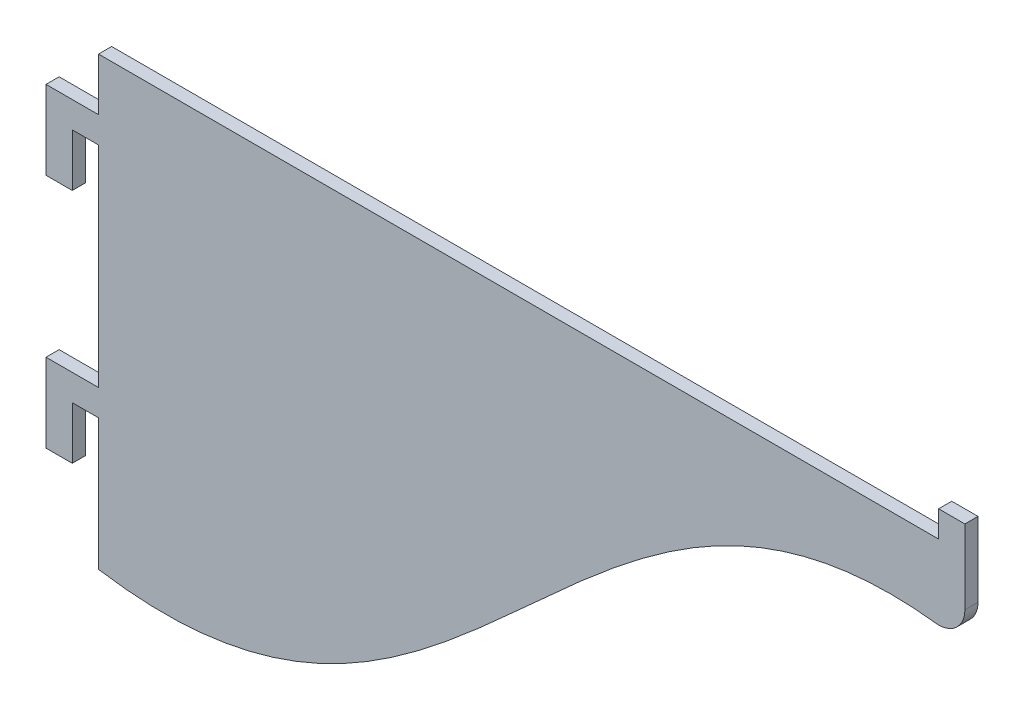
ISO-10303-21;
HEADER;
FILE_DESCRIPTION(('STEP AP214'),'2;1');
FILE_NAME('part.step','',(''),(''),'','','');
FILE_SCHEMA(('AUTOMOTIVE_DESIGN { 1 0 10303 214 1 1 1 1 }'));
ENDSEC;
DATA;
#1=APPLICATION_CONTEXT('core data for automotive mechanical design processes');
#2=APPLICATION_PROTOCOL_DEFINITION('international standard','automotive_design',2000,#1);
#3=PRODUCT_CONTEXT('',#1,'mechanical');
#4=PRODUCT('Part','Part','',(#3));
#5=PRODUCT_RELATED_PRODUCT_CATEGORY('part','',(#4));
#6=PRODUCT_DEFINITION_FORMATION('','',#4);
#7=PRODUCT_DEFINITION_CONTEXT('part definition',#1,'design');
#8=PRODUCT_DEFINITION('design','',#6,#7);
#9=PRODUCT_DEFINITION_SHAPE('','',#8);
#10=(LENGTH_UNIT() NAMED_UNIT(*) SI_UNIT(.MILLI.,.METRE.));
#11=(NAMED_UNIT(*) PLANE_ANGLE_UNIT() SI_UNIT($,.RADIAN.));
#12=(NAMED_UNIT(*) SI_UNIT($,.STERADIAN.) SOLID_ANGLE_UNIT());
#13=UNCERTAINTY_MEASURE_WITH_UNIT(LENGTH_MEASURE(1.E-05),#10,'distance_accuracy_value','');
#14=(GEOMETRIC_REPRESENTATION_CONTEXT(3) GLOBAL_UNCERTAINTY_ASSIGNED_CONTEXT((#13)) GLOBAL_UNIT_ASSIGNED_CONTEXT((#10,
#11,#12)) REPRESENTATION_CONTEXT('',''));
#15=CARTESIAN_POINT('',(0.,0.,0.));
#16=DIRECTION('',(0.,0.,1.));
#17=DIRECTION('',(1.,0.,0.));
#18=AXIS2_PLACEMENT_3D('',#15,#16,#17);
#19=CARTESIAN_POINT('',(0.,0.,3.175));
#20=DIRECTION('',(0.,-1.,0.));
#21=DIRECTION('',(0.,0.,-1.));
#22=AXIS2_PLACEMENT_3D('',#19,#20,#21);
#23=PLANE('',#22);
#24=DIRECTION('',(-1.,0.,0.));
#25=VECTOR('',#24,1.);
#26=CARTESIAN_POINT('',(0.,0.,0.));
#27=LINE('',#26,#25);
#28=CARTESIAN_POINT('',(203.2,0.,0.));
#29=VERTEX_POINT('',#28);
#30=CARTESIAN_POINT('',(0.,0.,0.));
#31=VERTEX_POINT('',#30);
#32=EDGE_CURVE('E210',#29,#31,#27,.T.);
#33=ORIENTED_EDGE('',*,*,#32,.T.);
#34=DIRECTION('',(0.,0.,-1.));
#35=VECTOR('',#34,1.);
#36=CARTESIAN_POINT('',(0.,0.,3.175));
#37=LINE('',#36,#35);
#38=CARTESIAN_POINT('',(0.,0.,3.175));
#39=VERTEX_POINT('',#38);
#40=EDGE_CURVE('E11',#39,#31,#37,.T.);
#41=ORIENTED_EDGE('',*,*,#40,.F.);
#42=DIRECTION('',(-1.,0.,0.));
#43=VECTOR('',#42,1.);
#44=CARTESIAN_POINT('',(0.,0.,3.175));
#45=LINE('',#44,#43);
#46=CARTESIAN_POINT('',(203.2,0.,3.175));
#47=VERTEX_POINT('',#46);
#48=EDGE_CURVE('E270',#47,#39,#45,.T.);
#49=ORIENTED_EDGE('',*,*,#48,.F.);
#50=DIRECTION('',(0.,0.,-1.));
#51=VECTOR('',#50,1.);
#52=CARTESIAN_POINT('',(203.2,0.,3.175));
#53=LINE('',#52,#51);
#54=EDGE_CURVE('E206',#47,#29,#53,.T.);
#55=ORIENTED_EDGE('',*,*,#54,.T.);
#56=EDGE_LOOP('',(#33,#41,#49,#55));
#57=FACE_BOUND('',#56,.T.);
#58=ADVANCED_FACE('F43',(#57),#23,.F.);
#59=CARTESIAN_POINT('',(0.,0.,3.175));
#60=DIRECTION('',(1.,0.,0.));
#61=DIRECTION('',(0.,1.,0.));
#62=AXIS2_PLACEMENT_3D('',#59,#60,#61);
#63=PLANE('',#62);
#64=DIRECTION('',(0.,-1.,0.));
#65=VECTOR('',#64,1.);
#66=CARTESIAN_POINT('',(0.,0.,0.));
#67=LINE('',#66,#65);
#68=CARTESIAN_POINT('',(0.,-12.7,0.));
#69=VERTEX_POINT('',#68);
#70=EDGE_CURVE('E214',#31,#69,#67,.T.);
#71=ORIENTED_EDGE('',*,*,#70,.T.);
#72=DIRECTION('',(0.,0.,-1.));
#73=VECTOR('',#72,1.);
#74=CARTESIAN_POINT('',(0.,-12.7,3.175));
#75=LINE('',#74,#73);
#76=CARTESIAN_POINT('',(0.,-12.7,3.175));
#77=VERTEX_POINT('',#76);
#78=EDGE_CURVE('E52',#77,#69,#75,.T.);
#79=ORIENTED_EDGE('',*,*,#78,.F.);
#80=DIRECTION('',(0.,-1.,0.));
#81=VECTOR('',#80,1.);
#82=CARTESIAN_POINT('',(0.,0.,3.175));
#83=LINE('',#82,#81);
#84=EDGE_CURVE('E136',#39,#77,#83,.T.);
#85=ORIENTED_EDGE('',*,*,#84,.F.);
#86=ORIENTED_EDGE('',*,*,#40,.T.);
#87=EDGE_LOOP('',(#71,#79,#85,#86));
#88=FACE_BOUND('',#87,.T.);
#89=ADVANCED_FACE('F443',(#88),#63,.F.);
#90=CARTESIAN_POINT('',(0.,-12.7,3.175));
#91=DIRECTION('',(0.,-1.,0.));
#92=DIRECTION('',(1.,0.,0.));
#93=AXIS2_PLACEMENT_3D('',#90,#91,#92);
#94=PLANE('',#93);
#95=DIRECTION('',(-1.,0.,0.));
#96=VECTOR('',#95,1.);
#97=CARTESIAN_POINT('',(0.,-12.7,0.));
#98=LINE('',#97,#96);
#99=CARTESIAN_POINT('',(-12.7,-12.7,0.));
#100=VERTEX_POINT('',#99);
#101=EDGE_CURVE('E217',#69,#100,#98,.T.);
#102=ORIENTED_EDGE('',*,*,#101,.T.);
#103=DIRECTION('',(0.,0.,-1.));
#104=VECTOR('',#103,1.);
#105=CARTESIAN_POINT('',(-12.7,-12.7,3.175));
#106=LINE('',#105,#104);
#107=CARTESIAN_POINT('',(-12.7,-12.7,3.175));
#108=VERTEX_POINT('',#107);
#109=EDGE_CURVE('E325',#108,#100,#106,.T.);
#110=ORIENTED_EDGE('',*,*,#109,.F.);
#111=DIRECTION('',(-1.,0.,0.));
#112=VECTOR('',#111,1.);
#113=CARTESIAN_POINT('',(0.,-12.7,3.175));
#114=LINE('',#113,#112);
#115=EDGE_CURVE('E335',#77,#108,#114,.T.);
#116=ORIENTED_EDGE('',*,*,#115,.F.);
#117=ORIENTED_EDGE('',*,*,#78,.T.);
#118=EDGE_LOOP('',(#102,#110,#116,#117));
#119=FACE_BOUND('',#118,.T.);
#120=ADVANCED_FACE('F333',(#119),#94,.F.);
#121=CARTESIAN_POINT('',(-12.7,-12.7,3.175));
#122=DIRECTION('',(1.,0.,0.));
#123=DIRECTION('',(0.,1.,0.));
#124=AXIS2_PLACEMENT_3D('',#121,#122,#123);
#125=PLANE('',#124);
#126=DIRECTION('',(0.,-1.,0.));
#127=VECTOR('',#126,1.);
#128=CARTESIAN_POINT('',(-12.7,-12.7,0.));
#129=LINE('',#128,#127);
#130=CARTESIAN_POINT('',(-12.7,-31.75,0.));
#131=VERTEX_POINT('',#130);
#132=EDGE_CURVE('E220',#100,#131,#129,.T.);
#133=ORIENTED_EDGE('',*,*,#132,.T.);
#134=DIRECTION('',(0.,0.,-1.));
#135=VECTOR('',#134,1.);
#136=CARTESIAN_POINT('',(-12.7,-31.75,3.175));
#137=LINE('',#136,#135);
#138=CARTESIAN_POINT('',(-12.7,-31.75,3.175));
#139=VERTEX_POINT('',#138);
#140=EDGE_CURVE('E321',#139,#131,#137,.T.);
#141=ORIENTED_EDGE('',*,*,#140,.F.);
#142=DIRECTION('',(0.,-1.,0.));
#143=VECTOR('',#142,1.);
#144=CARTESIAN_POINT('',(-12.7,-12.7,3.175));
#145=LINE('',#144,#143);
#146=EDGE_CURVE('E354',#108,#139,#145,.T.);
#147=ORIENTED_EDGE('',*,*,#146,.F.);
#148=ORIENTED_EDGE('',*,*,#109,.T.);
#149=EDGE_LOOP('',(#133,#141,#147,#148));
#150=FACE_BOUND('',#149,.T.);
#151=ADVANCED_FACE('F344',(#150),#125,.F.);
#152=CARTESIAN_POINT('',(-12.7,-31.75,3.175));
#153=DIRECTION('',(0.,1.,0.));
#154=DIRECTION('',(0.,0.,1.));
#155=AXIS2_PLACEMENT_3D('',#152,#153,#154);
#156=PLANE('',#155);
#157=DIRECTION('',(1.,0.,0.));
#158=VECTOR('',#157,1.);
#159=CARTESIAN_POINT('',(-12.7,-31.75,0.));
#160=LINE('',#159,#158);
#161=CARTESIAN_POINT('',(-6.35,-31.75,0.));
#162=VERTEX_POINT('',#161);
#163=EDGE_CURVE('E223',#131,#162,#160,.T.);
#164=ORIENTED_EDGE('',*,*,#163,.T.);
#165=DIRECTION('',(0.,0.,-1.));
#166=VECTOR('',#165,1.);
#167=CARTESIAN_POINT('',(-6.35,-31.75,3.175));
#168=LINE('',#167,#166);
#169=CARTESIAN_POINT('',(-6.35,-31.75,3.175));
#170=VERTEX_POINT('',#169);
#171=EDGE_CURVE('E317',#170,#162,#168,.T.);
#172=ORIENTED_EDGE('',*,*,#171,.F.);
#173=DIRECTION('',(1.,0.,0.));
#174=VECTOR('',#173,1.);
#175=CARTESIAN_POINT('',(-12.7,-31.75,3.175));
#176=LINE('',#175,#174);
#177=EDGE_CURVE('E350',#139,#170,#176,.T.);
#178=ORIENTED_EDGE('',*,*,#177,.F.);
#179=ORIENTED_EDGE('',*,*,#140,.T.);
#180=EDGE_LOOP('',(#164,#172,#178,#179));
#181=FACE_BOUND('',#180,.T.);
#182=ADVANCED_FACE('F348',(#181),#156,.F.);
#183=CARTESIAN_POINT('',(-6.35,-31.75,3.175));
#184=DIRECTION('',(-1.,0.,0.));
#185=DIRECTION('',(0.,-1.,0.));
#186=AXIS2_PLACEMENT_3D('',#183,#184,#185);
#187=PLANE('',#186);
#188=DIRECTION('',(0.,1.,0.));
#189=VECTOR('',#188,1.);
#190=CARTESIAN_POINT('',(-6.35,-31.75,0.));
#191=LINE('',#190,#189);
#192=CARTESIAN_POINT('',(-6.35,-19.05,0.));
#193=VERTEX_POINT('',#192);
#194=EDGE_CURVE('E226',#162,#193,#191,.T.);
#195=ORIENTED_EDGE('',*,*,#194,.T.);
#196=DIRECTION('',(0.,0.,-1.));
#197=VECTOR('',#196,1.);
#198=CARTESIAN_POINT('',(-6.35,-19.05,3.175));
#199=LINE('',#198,#197);
#200=CARTESIAN_POINT('',(-6.35,-19.05,3.175));
#201=VERTEX_POINT('',#200);
#202=EDGE_CURVE('E313',#201,#193,#199,.T.);
#203=ORIENTED_EDGE('',*,*,#202,.F.);
#204=DIRECTION('',(0.,1.,0.));
#205=VECTOR('',#204,1.);
#206=CARTESIAN_POINT('',(-6.35,-31.75,3.175));
#207=LINE('',#206,#205);
#208=EDGE_CURVE('E353',#170,#201,#207,.T.);
#209=ORIENTED_EDGE('',*,*,#208,.F.);
#210=ORIENTED_EDGE('',*,*,#171,.T.);
#211=EDGE_LOOP('',(#195,#203,#209,#210));
#212=FACE_BOUND('',#211,.T.);
#213=ADVANCED_FACE('F433',(#212),#187,.F.);
#214=CARTESIAN_POINT('',(-6.35,-19.05,3.175));
#215=DIRECTION('',(0.,1.,0.));
#216=DIRECTION('',(0.,0.,1.));
#217=AXIS2_PLACEMENT_3D('',#214,#215,#216);
#218=PLANE('',#217);
#219=DIRECTION('',(1.,0.,0.));
#220=VECTOR('',#219,1.);
#221=CARTESIAN_POINT('',(-6.35,-19.05,0.));
#222=LINE('',#221,#220);
#223=CARTESIAN_POINT('',(0.,-19.05,0.));
#224=VERTEX_POINT('',#223);
#225=EDGE_CURVE('E229',#193,#224,#222,.T.);
#226=ORIENTED_EDGE('',*,*,#225,.T.);
#227=DIRECTION('',(0.,0.,-1.));
#228=VECTOR('',#227,1.);
#229=CARTESIAN_POINT('',(0.,-19.05,3.175));
#230=LINE('',#229,#228);
#231=CARTESIAN_POINT('',(0.,-19.05,3.175));
#232=VERTEX_POINT('',#231);
#233=EDGE_CURVE('E309',#232,#224,#230,.T.);
#234=ORIENTED_EDGE('',*,*,#233,.F.);
#235=DIRECTION('',(1.,0.,0.));
#236=VECTOR('',#235,1.);
#237=CARTESIAN_POINT('',(-6.35,-19.05,3.175));
#238=LINE('',#237,#236);
#239=EDGE_CURVE('E358',#201,#232,#238,.T.);
#240=ORIENTED_EDGE('',*,*,#239,.F.);
#241=ORIENTED_EDGE('',*,*,#202,.T.);
#242=EDGE_LOOP('',(#226,#234,#240,#241));
#243=FACE_BOUND('',#242,.T.);
#244=ADVANCED_FACE('F429',(#243),#218,.F.);
#245=CARTESIAN_POINT('',(0.,-19.05,3.175));
#246=DIRECTION('',(1.,0.,0.));
#247=DIRECTION('',(0.,1.,0.));
#248=AXIS2_PLACEMENT_3D('',#245,#246,#247);
#249=PLANE('',#248);
#250=DIRECTION('',(0.,-1.,0.));
#251=VECTOR('',#250,1.);
#252=CARTESIAN_POINT('',(0.,-19.05,0.));
#253=LINE('',#252,#251);
#254=CARTESIAN_POINT('',(0.,-69.85,0.));
#255=VERTEX_POINT('',#254);
#256=EDGE_CURVE('E232',#224,#255,#253,.T.);
#257=ORIENTED_EDGE('',*,*,#256,.T.);
#258=DIRECTION('',(0.,0.,-1.));
#259=VECTOR('',#258,1.);
#260=CARTESIAN_POINT('',(0.,-69.85,3.175));
#261=LINE('',#260,#259);
#262=CARTESIAN_POINT('',(0.,-69.85,3.175));
#263=VERTEX_POINT('',#262);
#264=EDGE_CURVE('E305',#263,#255,#261,.T.);
#265=ORIENTED_EDGE('',*,*,#264,.F.);
#266=DIRECTION('',(0.,-1.,0.));
#267=VECTOR('',#266,1.);
#268=CARTESIAN_POINT('',(0.,-19.05,3.175));
#269=LINE('',#268,#267);
#270=EDGE_CURVE('E365',#232,#263,#269,.T.);
#271=ORIENTED_EDGE('',*,*,#270,.F.);
#272=ORIENTED_EDGE('',*,*,#233,.T.);
#273=EDGE_LOOP('',(#257,#265,#271,#272));
#274=FACE_BOUND('',#273,.T.);
#275=ADVANCED_FACE('F425',(#274),#249,.F.);
#276=CARTESIAN_POINT('',(0.,-69.85,3.175));
#277=DIRECTION('',(0.,-1.,0.));
#278=DIRECTION('',(0.,0.,-1.));
#279=AXIS2_PLACEMENT_3D('',#276,#277,#278);
#280=PLANE('',#279);
#281=DIRECTION('',(-1.,0.,0.));
#282=VECTOR('',#281,1.);
#283=CARTESIAN_POINT('',(0.,-69.85,0.));
#284=LINE('',#283,#282);
#285=CARTESIAN_POINT('',(-12.7,-69.85,0.));
#286=VERTEX_POINT('',#285);
#287=EDGE_CURVE('E235',#255,#286,#284,.T.);
#288=ORIENTED_EDGE('',*,*,#287,.T.);
#289=DIRECTION('',(0.,0.,-1.));
#290=VECTOR('',#289,1.);
#291=CARTESIAN_POINT('',(-12.7,-69.85,3.175));
#292=LINE('',#291,#290);
#293=CARTESIAN_POINT('',(-12.7,-69.85,3.175));
#294=VERTEX_POINT('',#293);
#295=EDGE_CURVE('E301',#294,#286,#292,.T.);
#296=ORIENTED_EDGE('',*,*,#295,.F.);
#297=DIRECTION('',(-1.,0.,0.));
#298=VECTOR('',#297,1.);
#299=CARTESIAN_POINT('',(0.,-69.85,3.175));
#300=LINE('',#299,#298);
#301=EDGE_CURVE('E368',#263,#294,#300,.T.);
#302=ORIENTED_EDGE('',*,*,#301,.F.);
#303=ORIENTED_EDGE('',*,*,#264,.T.);
#304=EDGE_LOOP('',(#288,#296,#302,#303));
#305=FACE_BOUND('',#304,.T.);
#306=ADVANCED_FACE('F421',(#305),#280,.F.);
#307=CARTESIAN_POINT('',(-12.7,-69.85,3.175));
#308=DIRECTION('',(1.,0.,0.));
#309=DIRECTION('',(0.,1.,0.));
#310=AXIS2_PLACEMENT_3D('',#307,#308,#309);
#311=PLANE('',#310);
#312=DIRECTION('',(0.,-1.,0.));
#313=VECTOR('',#312,1.);
#314=CARTESIAN_POINT('',(-12.7,-69.85,0.));
#315=LINE('',#314,#313);
#316=CARTESIAN_POINT('',(-12.7,-88.9,0.));
#317=VERTEX_POINT('',#316);
#318=EDGE_CURVE('E238',#286,#317,#315,.T.);
#319=ORIENTED_EDGE('',*,*,#318,.T.);
#320=DIRECTION('',(0.,0.,-1.));
#321=VECTOR('',#320,1.);
#322=CARTESIAN_POINT('',(-12.7,-88.9,3.175));
#323=LINE('',#322,#321);
#324=CARTESIAN_POINT('',(-12.7,-88.9,3.175));
#325=VERTEX_POINT('',#324);
#326=EDGE_CURVE('E297',#325,#317,#323,.T.);
#327=ORIENTED_EDGE('',*,*,#326,.F.);
#328=DIRECTION('',(0.,-1.,0.));
#329=VECTOR('',#328,1.);
#330=CARTESIAN_POINT('',(-12.7,-69.85,3.175));
#331=LINE('',#330,#329);
#332=EDGE_CURVE('E371',#294,#325,#331,.T.);
#333=ORIENTED_EDGE('',*,*,#332,.F.);
#334=ORIENTED_EDGE('',*,*,#295,.T.);
#335=EDGE_LOOP('',(#319,#327,#333,#334));
#336=FACE_BOUND('',#335,.T.);
#337=ADVANCED_FACE('F417',(#336),#311,.F.);
#338=CARTESIAN_POINT('',(-12.7,-88.9,3.175));
#339=DIRECTION('',(0.,1.,0.));
#340=DIRECTION('',(0.,0.,1.));
#341=AXIS2_PLACEMENT_3D('',#338,#339,#340);
#342=PLANE('',#341);
#343=DIRECTION('',(1.,0.,0.));
#344=VECTOR('',#343,1.);
#345=CARTESIAN_POINT('',(-12.7,-88.9,0.));
#346=LINE('',#345,#344);
#347=CARTESIAN_POINT('',(-6.34999999999999,-88.9,0.));
#348=VERTEX_POINT('',#347);
#349=EDGE_CURVE('E241',#317,#348,#346,.T.);
#350=ORIENTED_EDGE('',*,*,#349,.T.);
#351=DIRECTION('',(0.,0.,-1.));
#352=VECTOR('',#351,1.);
#353=CARTESIAN_POINT('',(-6.34999999999999,-88.9,3.175));
#354=LINE('',#353,#352);
#355=CARTESIAN_POINT('',(-6.34999999999999,-88.9,3.175));
#356=VERTEX_POINT('',#355);
#357=EDGE_CURVE('E293',#356,#348,#354,.T.);
#358=ORIENTED_EDGE('',*,*,#357,.F.);
#359=DIRECTION('',(1.,0.,0.));
#360=VECTOR('',#359,1.);
#361=CARTESIAN_POINT('',(-12.7,-88.9,3.175));
#362=LINE('',#361,#360);
#363=EDGE_CURVE('E374',#325,#356,#362,.T.);
#364=ORIENTED_EDGE('',*,*,#363,.F.);
#365=ORIENTED_EDGE('',*,*,#326,.T.);
#366=EDGE_LOOP('',(#350,#358,#364,#365));
#367=FACE_BOUND('',#366,.T.);
#368=ADVANCED_FACE('F413',(#367),#342,.F.);
#369=CARTESIAN_POINT('',(-6.34999999999999,-88.9,3.175));
#370=DIRECTION('',(-1.,0.,0.));
#371=DIRECTION('',(0.,0.,1.));
#372=AXIS2_PLACEMENT_3D('',#369,#370,#371);
#373=PLANE('',#372);
#374=DIRECTION('',(0.,1.,0.));
#375=VECTOR('',#374,1.);
#376=CARTESIAN_POINT('',(-6.34999999999999,-88.9,0.));
#377=LINE('',#376,#375);
#378=CARTESIAN_POINT('',(-6.34999999999999,-76.2,0.));
#379=VERTEX_POINT('',#378);
#380=EDGE_CURVE('E244',#348,#379,#377,.T.);
#381=ORIENTED_EDGE('',*,*,#380,.T.);
#382=DIRECTION('',(0.,0.,-1.));
#383=VECTOR('',#382,1.);
#384=CARTESIAN_POINT('',(-6.34999999999999,-76.2,3.175));
#385=LINE('',#384,#383);
#386=CARTESIAN_POINT('',(-6.34999999999999,-76.2,3.175));
#387=VERTEX_POINT('',#386);
#388=EDGE_CURVE('E289',#387,#379,#385,.T.);
#389=ORIENTED_EDGE('',*,*,#388,.F.);
#390=DIRECTION('',(0.,1.,0.));
#391=VECTOR('',#390,1.);
#392=CARTESIAN_POINT('',(-6.34999999999999,-88.9,3.175));
#393=LINE('',#392,#391);
#394=EDGE_CURVE('E377',#356,#387,#393,.T.);
#395=ORIENTED_EDGE('',*,*,#394,.F.);
#396=ORIENTED_EDGE('',*,*,#357,.T.);
#397=EDGE_LOOP('',(#381,#389,#395,#396));
#398=FACE_BOUND('',#397,.T.);
#399=ADVANCED_FACE('F409',(#398),#373,.F.);
#400=CARTESIAN_POINT('',(-6.34999999999999,-76.2,3.175));
#401=DIRECTION('',(0.,1.,0.));
#402=DIRECTION('',(0.,0.,1.));
#403=AXIS2_PLACEMENT_3D('',#400,#401,#402);
#404=PLANE('',#403);
#405=DIRECTION('',(1.,0.,0.));
#406=VECTOR('',#405,1.);
#407=CARTESIAN_POINT('',(-6.34999999999999,-76.2,0.));
#408=LINE('',#407,#406);
#409=CARTESIAN_POINT('',(0.,-76.2,0.));
#410=VERTEX_POINT('',#409);
#411=EDGE_CURVE('E247',#379,#410,#408,.T.);
#412=ORIENTED_EDGE('',*,*,#411,.T.);
#413=DIRECTION('',(0.,0.,-1.));
#414=VECTOR('',#413,1.);
#415=CARTESIAN_POINT('',(0.,-76.2,3.175));
#416=LINE('',#415,#414);
#417=CARTESIAN_POINT('',(0.,-76.2,3.175));
#418=VERTEX_POINT('',#417);
#419=EDGE_CURVE('E285',#418,#410,#416,.T.);
#420=ORIENTED_EDGE('',*,*,#419,.F.);
#421=DIRECTION('',(1.,0.,0.));
#422=VECTOR('',#421,1.);
#423=CARTESIAN_POINT('',(-6.34999999999999,-76.2,3.175));
#424=LINE('',#423,#422);
#425=EDGE_CURVE('E380',#387,#418,#424,.T.);
#426=ORIENTED_EDGE('',*,*,#425,.F.);
#427=ORIENTED_EDGE('',*,*,#388,.T.);
#428=EDGE_LOOP('',(#412,#420,#426,#427));
#429=FACE_BOUND('',#428,.T.);
#430=ADVANCED_FACE('F405',(#429),#404,.F.);
#431=CARTESIAN_POINT('',(0.,-76.2,3.175));
#432=DIRECTION('',(1.,0.,0.));
#433=DIRECTION('',(0.,1.,0.));
#434=AXIS2_PLACEMENT_3D('',#431,#432,#433);
#435=PLANE('',#434);
#436=DIRECTION('',(0.,-1.,0.));
#437=VECTOR('',#436,1.);
#438=CARTESIAN_POINT('',(0.,-76.2,0.));
#439=LINE('',#438,#437);
#440=CARTESIAN_POINT('',(0.,-107.95,0.));
#441=VERTEX_POINT('',#440);
#442=EDGE_CURVE('E250',#410,#441,#439,.T.);
#443=ORIENTED_EDGE('',*,*,#442,.T.);
#444=DIRECTION('',(0.,0.,-1.));
#445=VECTOR('',#444,1.);
#446=CARTESIAN_POINT('',(0.,-107.95,3.175));
#447=LINE('',#446,#445);
#448=CARTESIAN_POINT('',(0.,-107.95,3.175));
#449=VERTEX_POINT('',#448);
#450=EDGE_CURVE('E281',#449,#441,#447,.T.);
#451=ORIENTED_EDGE('',*,*,#450,.F.);
#452=DIRECTION('',(0.,-1.,0.));
#453=VECTOR('',#452,1.);
#454=CARTESIAN_POINT('',(0.,-76.2,3.175));
#455=LINE('',#454,#453);
#456=EDGE_CURVE('E383',#418,#449,#455,.T.);
#457=ORIENTED_EDGE('',*,*,#456,.F.);
#458=ORIENTED_EDGE('',*,*,#419,.T.);
#459=EDGE_LOOP('',(#443,#451,#457,#458));
#460=FACE_BOUND('',#459,.T.);
#461=ADVANCED_FACE('F400',(#460),#435,.F.);
#462=CARTESIAN_POINT('',(0.,-107.95,3.175));
#463=CARTESIAN_POINT('',(64.9728824445973,-118.248903815368,3.175));
#464=CARTESIAN_POINT('',(107.260828456846,-42.0408010673958,3.175));
#465=CARTESIAN_POINT('',(176.720157178967,-14.8825406390589,3.175));
#466=CARTESIAN_POINT('',(202.448390099889,-17.9493901512116,3.175));
#467=B_SPLINE_CURVE_WITH_KNOTS('',3,(#462,#463,#464,#465,#466),.UNSPECIFIED.,.F.,.F.,(4,1,4),
(0.,0.687412435641465,0.974132151283514),.UNSPECIFIED.);
#468=DIRECTION('',(0.,0.,-1.));
#469=VECTOR('',#468,1.);
#470=SURFACE_OF_LINEAR_EXTRUSION('',#467,#469);
#471=CARTESIAN_POINT('',(0.,-107.95,0.));
#472=CARTESIAN_POINT('',(64.9728824445973,-118.248903815368,0.));
#473=CARTESIAN_POINT('',(107.260828456846,-42.0408010673958,0.));
#474=CARTESIAN_POINT('',(176.720157178967,-14.8825406390589,0.));
#475=CARTESIAN_POINT('',(202.448390099889,-17.9493901512116,0.));
#476=B_SPLINE_CURVE_WITH_KNOTS('',3,(#471,#472,#473,#474,#475),.UNSPECIFIED.,.F.,.F.,(4,1,4),
(0.,0.687412435641465,0.974132151283514),.UNSPECIFIED.);
#477=CARTESIAN_POINT('',(202.448390099889,-17.9493901512116,0.));
#478=VERTEX_POINT('',#477);
#479=EDGE_CURVE('E253',#441,#478,#476,.T.);
#480=ORIENTED_EDGE('',*,*,#479,.T.);
#481=DIRECTION('',(0.,0.,-1.));
#482=VECTOR('',#481,1.);
#483=CARTESIAN_POINT('',(202.448390099889,-17.9493901512116,3.175));
#484=LINE('',#483,#482);
#485=CARTESIAN_POINT('',(202.448390099889,-17.9493901512116,3.175));
#486=VERTEX_POINT('',#485);
#487=EDGE_CURVE('E277',#486,#478,#484,.T.);
#488=ORIENTED_EDGE('',*,*,#487,.F.);
#489=EDGE_CURVE('E386',#449,#486,#467,.T.);
#490=ORIENTED_EDGE('',*,*,#489,.F.);
#491=ORIENTED_EDGE('',*,*,#450,.T.);
#492=EDGE_LOOP('',(#480,#488,#490,#491));
#493=FACE_BOUND('',#492,.T.);
#494=ADVANCED_FACE('F395',(#493),#470,.F.);
#495=CARTESIAN_POINT('',(203.2,-11.6440287374578,3.175));
#496=DIRECTION('',(0.,0.,-1.));
#497=DIRECTION('',(-1.,0.,0.));
#498=AXIS2_PLACEMENT_3D('',#495,#496,#497);
#499=CYLINDRICAL_SURFACE('',#498,6.35);
#500=CARTESIAN_POINT('',(203.2,-11.6440287374578,0.));
#501=DIRECTION('',(0.,0.,1.));
#502=DIRECTION('',(1.,0.,0.));
#503=AXIS2_PLACEMENT_3D('',#500,#501,#502);
#504=CIRCLE('',#503,6.35);
#505=CARTESIAN_POINT('',(209.55,-11.6440287374578,0.));
#506=VERTEX_POINT('',#505);
#507=EDGE_CURVE('E258',#478,#506,#504,.T.);
#508=ORIENTED_EDGE('',*,*,#507,.T.);
#509=DIRECTION('',(0.,0.,-1.));
#510=VECTOR('',#509,1.);
#511=CARTESIAN_POINT('',(209.55,-11.6440287374578,3.175));
#512=LINE('',#511,#510);
#513=CARTESIAN_POINT('',(209.55,-11.6440287374578,3.175));
#514=VERTEX_POINT('',#513);
#515=EDGE_CURVE('E199',#514,#506,#512,.T.);
#516=ORIENTED_EDGE('',*,*,#515,.F.);
#517=CARTESIAN_POINT('',(203.2,-11.6440287374578,3.175));
#518=DIRECTION('',(0.,0.,1.));
#519=DIRECTION('',(1.,0.,0.));
#520=AXIS2_PLACEMENT_3D('',#517,#518,#519);
#521=CIRCLE('',#520,6.35);
#522=EDGE_CURVE('E188',#486,#514,#521,.T.);
#523=ORIENTED_EDGE('',*,*,#522,.F.);
#524=ORIENTED_EDGE('',*,*,#487,.T.);
#525=EDGE_LOOP('',(#508,#516,#523,#524));
#526=FACE_BOUND('',#525,.T.);
#527=ADVANCED_FACE('F399',(#526),#499,.T.);
#528=CARTESIAN_POINT('',(209.55,6.35,3.175));
#529=DIRECTION('',(-1.,0.,0.));
#530=DIRECTION('',(0.,-1.,0.));
#531=AXIS2_PLACEMENT_3D('',#528,#529,#530);
#532=PLANE('',#531);
#533=DIRECTION('',(0.,1.,0.));
#534=VECTOR('',#533,1.);
#535=CARTESIAN_POINT('',(209.55,6.35,0.));
#536=LINE('',#535,#534);
#537=CARTESIAN_POINT('',(209.55,6.35,0.));
#538=VERTEX_POINT('',#537);
#539=EDGE_CURVE('E197',#506,#538,#536,.T.);
#540=ORIENTED_EDGE('',*,*,#539,.T.);
#541=DIRECTION('',(0.,0.,-1.));
#542=VECTOR('',#541,1.);
#543=CARTESIAN_POINT('',(209.55,6.35,3.175));
#544=LINE('',#543,#542);
#545=CARTESIAN_POINT('',(209.55,6.35,3.175));
#546=VERTEX_POINT('',#545);
#547=EDGE_CURVE('E194',#546,#538,#544,.T.);
#548=ORIENTED_EDGE('',*,*,#547,.F.);
#549=DIRECTION('',(0.,1.,0.));
#550=VECTOR('',#549,1.);
#551=CARTESIAN_POINT('',(209.55,6.35,3.175));
#552=LINE('',#551,#550);
#553=EDGE_CURVE('E182',#514,#546,#552,.T.);
#554=ORIENTED_EDGE('',*,*,#553,.F.);
#555=ORIENTED_EDGE('',*,*,#515,.T.);
#556=EDGE_LOOP('',(#540,#548,#554,#555));
#557=FACE_BOUND('',#556,.T.);
#558=ADVANCED_FACE('F195',(#557),#532,.F.);
#559=CARTESIAN_POINT('',(203.2,6.35,3.175));
#560=DIRECTION('',(0.,-1.,0.));
#561=DIRECTION('',(0.,0.,-1.));
#562=AXIS2_PLACEMENT_3D('',#559,#560,#561);
#563=PLANE('',#562);
#564=DIRECTION('',(-1.,0.,0.));
#565=VECTOR('',#564,1.);
#566=CARTESIAN_POINT('',(203.2,6.35,0.));
#567=LINE('',#566,#565);
#568=CARTESIAN_POINT('',(203.2,6.35,0.));
#569=VERTEX_POINT('',#568);
#570=EDGE_CURVE('E122',#538,#569,#567,.T.);
#571=ORIENTED_EDGE('',*,*,#570,.T.);
#572=DIRECTION('',(0.,0.,-1.));
#573=VECTOR('',#572,1.);
#574=CARTESIAN_POINT('',(203.2,6.35,3.175));
#575=LINE('',#574,#573);
#576=CARTESIAN_POINT('',(203.2,6.35,3.175));
#577=VERTEX_POINT('',#576);
#578=EDGE_CURVE('E200',#577,#569,#575,.T.);
#579=ORIENTED_EDGE('',*,*,#578,.F.);
#580=DIRECTION('',(-1.,0.,0.));
#581=VECTOR('',#580,1.);
#582=CARTESIAN_POINT('',(203.2,6.35,3.175));
#583=LINE('',#582,#581);
#584=EDGE_CURVE('E186',#546,#577,#583,.T.);
#585=ORIENTED_EDGE('',*,*,#584,.F.);
#586=ORIENTED_EDGE('',*,*,#547,.T.);
#587=EDGE_LOOP('',(#571,#579,#585,#586));
#588=FACE_BOUND('',#587,.T.);
#589=ADVANCED_FACE('F202',(#588),#563,.F.);
#590=CARTESIAN_POINT('',(203.2,0.,3.175));
#591=DIRECTION('',(1.,0.,0.));
#592=DIRECTION('',(0.,0.,-1.));
#593=AXIS2_PLACEMENT_3D('',#590,#591,#592);
#594=PLANE('',#593);
#595=DIRECTION('',(0.,-1.,0.));
#596=VECTOR('',#595,1.);
#597=CARTESIAN_POINT('',(203.2,0.,0.));
#598=LINE('',#597,#596);
#599=EDGE_CURVE('E128',#569,#29,#598,.T.);
#600=ORIENTED_EDGE('',*,*,#599,.T.);
#601=ORIENTED_EDGE('',*,*,#54,.F.);
#602=DIRECTION('',(0.,-1.,0.));
#603=VECTOR('',#602,1.);
#604=CARTESIAN_POINT('',(203.2,0.,3.175));
#605=LINE('',#604,#603);
#606=EDGE_CURVE('E60',#577,#47,#605,.T.);
#607=ORIENTED_EDGE('',*,*,#606,.F.);
#608=ORIENTED_EDGE('',*,*,#578,.T.);
#609=EDGE_LOOP('',(#600,#601,#607,#608));
#610=FACE_BOUND('',#609,.T.);
#611=ADVANCED_FACE('F489',(#610),#594,.F.);
#612=CARTESIAN_POINT('',(203.2,-11.6440287374578,3.175));
#613=DIRECTION('',(0.,0.,1.));
#614=DIRECTION('',(1.,0.,0.));
#615=AXIS2_PLACEMENT_3D('',#612,#613,#614);
#616=PLANE('',#615);
#617=ORIENTED_EDGE('',*,*,#48,.T.);
#618=ORIENTED_EDGE('',*,*,#84,.T.);
#619=ORIENTED_EDGE('',*,*,#115,.T.);
#620=ORIENTED_EDGE('',*,*,#146,.T.);
#621=ORIENTED_EDGE('',*,*,#177,.T.);
#622=ORIENTED_EDGE('',*,*,#208,.T.);
#623=ORIENTED_EDGE('',*,*,#239,.T.);
#624=ORIENTED_EDGE('',*,*,#270,.T.);
#625=ORIENTED_EDGE('',*,*,#301,.T.);
#626=ORIENTED_EDGE('',*,*,#332,.T.);
#627=ORIENTED_EDGE('',*,*,#363,.T.);
#628=ORIENTED_EDGE('',*,*,#394,.T.);
#629=ORIENTED_EDGE('',*,*,#425,.T.);
#630=ORIENTED_EDGE('',*,*,#456,.T.);
#631=ORIENTED_EDGE('',*,*,#489,.T.);
#632=ORIENTED_EDGE('',*,*,#522,.T.);
#633=ORIENTED_EDGE('',*,*,#553,.T.);
#634=ORIENTED_EDGE('',*,*,#584,.T.);
#635=ORIENTED_EDGE('',*,*,#606,.T.);
#636=EDGE_LOOP('',(#617,#618,#619,#620,#621,#622,#623,#624,#625,#626,#627,#628,#629,#630,#631,
#632,#633,#634,#635));
#637=FACE_BOUND('',#636,.T.);
#638=ADVANCED_FACE('F184',(#637),#616,.T.);
#639=CARTESIAN_POINT('',(203.2,-11.6440287374578,0.));
#640=DIRECTION('',(0.,0.,1.));
#641=DIRECTION('',(1.,0.,0.));
#642=AXIS2_PLACEMENT_3D('',#639,#640,#641);
#643=PLANE('',#642);
#644=ORIENTED_EDGE('',*,*,#32,.F.);
#645=ORIENTED_EDGE('',*,*,#599,.F.);
#646=ORIENTED_EDGE('',*,*,#570,.F.);
#647=ORIENTED_EDGE('',*,*,#539,.F.);
#648=ORIENTED_EDGE('',*,*,#507,.F.);
#649=ORIENTED_EDGE('',*,*,#479,.F.);
#650=ORIENTED_EDGE('',*,*,#442,.F.);
#651=ORIENTED_EDGE('',*,*,#411,.F.);
#652=ORIENTED_EDGE('',*,*,#380,.F.);
#653=ORIENTED_EDGE('',*,*,#349,.F.);
#654=ORIENTED_EDGE('',*,*,#318,.F.);
#655=ORIENTED_EDGE('',*,*,#287,.F.);
#656=ORIENTED_EDGE('',*,*,#256,.F.);
#657=ORIENTED_EDGE('',*,*,#225,.F.);
#658=ORIENTED_EDGE('',*,*,#194,.F.);
#659=ORIENTED_EDGE('',*,*,#163,.F.);
#660=ORIENTED_EDGE('',*,*,#132,.F.);
#661=ORIENTED_EDGE('',*,*,#101,.F.);
#662=ORIENTED_EDGE('',*,*,#70,.F.);
#663=EDGE_LOOP('',(#644,#645,#646,#647,#648,#649,#650,#651,#652,#653,#654,#655,#656,#657,#658,
#659,#660,#661,#662));
#664=FACE_BOUND('',#663,.T.);
#665=ADVANCED_FACE('F339',(#664),#643,.F.);
#666=CLOSED_SHELL('',(#58,#89,#120,#151,#182,#213,#244,#275,#306,#337,#368,#399,#430,#461,#494,
#527,#558,#589,#611,#638,#665));
#667=MANIFOLD_SOLID_BREP('B2',#666);
#668=ADVANCED_BREP_SHAPE_REPRESENTATION('',(#18,#667),#14);
#669=SHAPE_DEFINITION_REPRESENTATION(#9,#668);
ENDSEC;
END-ISO-10303-21;
